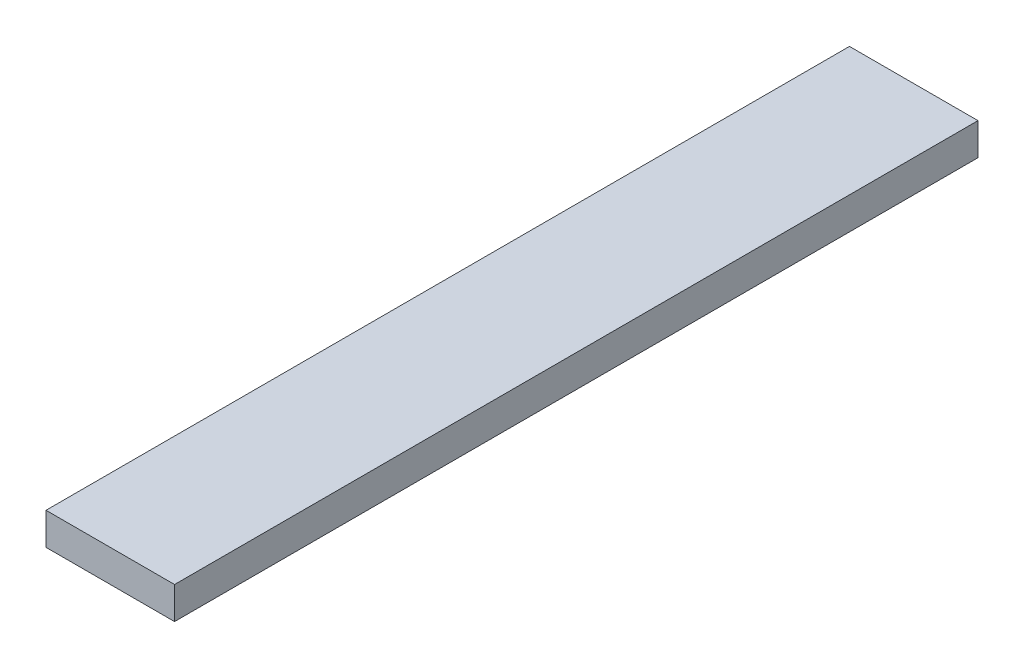
ISO-10303-21;
HEADER;
FILE_DESCRIPTION(('STEP AP214'),'2;1');
FILE_NAME('part.step','',(''),(''),'','','');
FILE_SCHEMA(('AUTOMOTIVE_DESIGN { 1 0 10303 214 1 1 1 1 }'));
ENDSEC;
DATA;
#1=APPLICATION_CONTEXT('core data for automotive mechanical design processes');
#2=APPLICATION_PROTOCOL_DEFINITION('international standard','automotive_design',2000,#1);
#3=PRODUCT_CONTEXT('',#1,'mechanical');
#4=PRODUCT('Part','Part','',(#3));
#5=PRODUCT_RELATED_PRODUCT_CATEGORY('part','',(#4));
#6=PRODUCT_DEFINITION_FORMATION('','',#4);
#7=PRODUCT_DEFINITION_CONTEXT('part definition',#1,'design');
#8=PRODUCT_DEFINITION('design','',#6,#7);
#9=PRODUCT_DEFINITION_SHAPE('','',#8);
#10=(LENGTH_UNIT() NAMED_UNIT(*) SI_UNIT(.MILLI.,.METRE.));
#11=(NAMED_UNIT(*) PLANE_ANGLE_UNIT() SI_UNIT($,.RADIAN.));
#12=(NAMED_UNIT(*) SI_UNIT($,.STERADIAN.) SOLID_ANGLE_UNIT());
#13=UNCERTAINTY_MEASURE_WITH_UNIT(LENGTH_MEASURE(1.E-05),#10,'distance_accuracy_value','');
#14=(GEOMETRIC_REPRESENTATION_CONTEXT(3) GLOBAL_UNCERTAINTY_ASSIGNED_CONTEXT((#13)) GLOBAL_UNIT_ASSIGNED_CONTEXT((#10,
#11,#12)) REPRESENTATION_CONTEXT('',''));
#15=CARTESIAN_POINT('',(0.,0.,0.));
#16=DIRECTION('',(0.,0.,1.));
#17=DIRECTION('',(1.,0.,0.));
#18=AXIS2_PLACEMENT_3D('',#15,#16,#17);
#19=CARTESIAN_POINT('',(0.,6.34999999999999,3.33066907387547E-13));
#20=DIRECTION('',(1.,0.,0.));
#21=DIRECTION('',(0.,0.,-1.));
#22=AXIS2_PLACEMENT_3D('',#19,#20,#21);
#23=PLANE('',#22);
#24=DIRECTION('',(0.,0.,1.));
#25=VECTOR('',#24,1.);
#26=CARTESIAN_POINT('',(0.,0.,0.));
#27=LINE('',#26,#25);
#28=CARTESIAN_POINT('',(1.38777878078145E-13,0.,-304.799999999999));
#29=VERTEX_POINT('',#28);
#30=CARTESIAN_POINT('',(1.38777878078145E-13,0.,-146.05));
#31=VERTEX_POINT('',#30);
#32=EDGE_CURVE('E99',#29,#31,#27,.T.);
#33=ORIENTED_EDGE('',*,*,#32,.T.);
#34=DIRECTION('',(0.,1.,0.));
#35=VECTOR('',#34,1.);
#36=CARTESIAN_POINT('',(1.38777878078145E-13,0.,-146.05));
#37=LINE('',#36,#35);
#38=CARTESIAN_POINT('',(0.,6.35000000000022,-146.05));
#39=VERTEX_POINT('',#38);
#40=EDGE_CURVE('E48',#31,#39,#37,.T.);
#41=ORIENTED_EDGE('',*,*,#40,.T.);
#42=DIRECTION('',(0.,0.,1.));
#43=VECTOR('',#42,1.);
#44=CARTESIAN_POINT('',(0.,6.34999999999999,3.33066907387547E-13));
#45=LINE('',#44,#43);
#46=CARTESIAN_POINT('',(0.,6.35000000000024,-304.799999999999));
#47=VERTEX_POINT('',#46);
#48=EDGE_CURVE('E101',#47,#39,#45,.T.);
#49=ORIENTED_EDGE('',*,*,#48,.F.);
#50=DIRECTION('',(0.,-1.,0.));
#51=VECTOR('',#50,1.);
#52=CARTESIAN_POINT('',(0.,6.35000000000024,-304.799999999999));
#53=LINE('',#52,#51);
#54=EDGE_CURVE('E11',#47,#29,#53,.T.);
#55=ORIENTED_EDGE('',*,*,#54,.T.);
#56=EDGE_LOOP('',(#33,#41,#49,#55));
#57=FACE_BOUND('',#56,.T.);
#58=ADVANCED_FACE('F34',(#57),#23,.F.);
#59=CARTESIAN_POINT('',(0.,6.35000000000024,-304.799999999999));
#60=DIRECTION('',(0.,0.,1.));
#61=DIRECTION('',(1.,0.,0.));
#62=AXIS2_PLACEMENT_3D('',#59,#60,#61);
#63=PLANE('',#62);
#64=DIRECTION('',(-1.,0.,0.));
#65=VECTOR('',#64,1.);
#66=CARTESIAN_POINT('',(0.,6.35000000000024,-304.799999999999));
#67=LINE('',#66,#65);
#68=CARTESIAN_POINT('',(25.4,6.35000000000002,-304.799999999999));
#69=VERTEX_POINT('',#68);
#70=EDGE_CURVE('E41',#69,#47,#67,.T.);
#71=ORIENTED_EDGE('',*,*,#70,.F.);
#72=DIRECTION('',(0.,1.,0.));
#73=VECTOR('',#72,1.);
#74=CARTESIAN_POINT('',(25.4000000000001,0.,-304.799999999999));
#75=LINE('',#74,#73);
#76=CARTESIAN_POINT('',(25.4000000000001,0.,-304.799999999999));
#77=VERTEX_POINT('',#76);
#78=EDGE_CURVE('E97',#77,#69,#75,.T.);
#79=ORIENTED_EDGE('',*,*,#78,.F.);
#80=DIRECTION('',(-1.,0.,0.));
#81=VECTOR('',#80,1.);
#82=CARTESIAN_POINT('',(1.38777878078145E-13,0.,-304.799999999999));
#83=LINE('',#82,#81);
#84=EDGE_CURVE('E91',#77,#29,#83,.T.);
#85=ORIENTED_EDGE('',*,*,#84,.T.);
#86=ORIENTED_EDGE('',*,*,#54,.F.);
#87=EDGE_LOOP('',(#71,#79,#85,#86));
#88=FACE_BOUND('',#87,.T.);
#89=ADVANCED_FACE('F105',(#88),#63,.F.);
#90=CARTESIAN_POINT('',(0.,6.34999999999999,3.33066907387547E-13));
#91=DIRECTION('',(0.,-1.,0.));
#92=DIRECTION('',(0.,0.,-1.));
#93=AXIS2_PLACEMENT_3D('',#90,#91,#92);
#94=PLANE('',#93);
#95=DIRECTION('',(-1.,0.,0.));
#96=VECTOR('',#95,1.);
#97=CARTESIAN_POINT('',(25.4,6.35000000000016,-146.05));
#98=LINE('',#97,#96);
#99=CARTESIAN_POINT('',(25.4,6.35000000000016,-146.05));
#100=VERTEX_POINT('',#99);
#101=EDGE_CURVE('E92',#100,#39,#98,.T.);
#102=ORIENTED_EDGE('',*,*,#101,.F.);
#103=DIRECTION('',(0.,0.,1.));
#104=VECTOR('',#103,1.);
#105=CARTESIAN_POINT('',(25.4,6.35000000000002,-304.799999999999));
#106=LINE('',#105,#104);
#107=EDGE_CURVE('E80',#69,#100,#106,.T.);
#108=ORIENTED_EDGE('',*,*,#107,.F.);
#109=ORIENTED_EDGE('',*,*,#70,.T.);
#110=ORIENTED_EDGE('',*,*,#48,.T.);
#111=EDGE_LOOP('',(#102,#108,#109,#110));
#112=FACE_BOUND('',#111,.T.);
#113=ADVANCED_FACE('F108',(#112),#94,.F.);
#114=CARTESIAN_POINT('',(0.,0.,0.));
#115=DIRECTION('',(0.,-1.,0.));
#116=DIRECTION('',(0.,0.,-1.));
#117=AXIS2_PLACEMENT_3D('',#114,#115,#116);
#118=PLANE('',#117);
#119=DIRECTION('',(0.,0.,1.));
#120=VECTOR('',#119,1.);
#121=CARTESIAN_POINT('',(25.4000000000001,0.,-304.799999999999));
#122=LINE('',#121,#120);
#123=CARTESIAN_POINT('',(25.4,2.22044604925031E-13,-146.05));
#124=VERTEX_POINT('',#123);
#125=EDGE_CURVE('E78',#77,#124,#122,.T.);
#126=ORIENTED_EDGE('',*,*,#125,.T.);
#127=DIRECTION('',(-1.,0.,0.));
#128=VECTOR('',#127,1.);
#129=CARTESIAN_POINT('',(25.4,2.22044604925031E-13,-146.05));
#130=LINE('',#129,#128);
#131=EDGE_CURVE('E82',#124,#31,#130,.T.);
#132=ORIENTED_EDGE('',*,*,#131,.T.);
#133=ORIENTED_EDGE('',*,*,#32,.F.);
#134=ORIENTED_EDGE('',*,*,#84,.F.);
#135=EDGE_LOOP('',(#126,#132,#133,#134));
#136=FACE_BOUND('',#135,.T.);
#137=ADVANCED_FACE('F90',(#136),#118,.T.);
#138=CARTESIAN_POINT('',(25.4000000000001,0.,-304.799999999999));
#139=DIRECTION('',(-1.,0.,0.));
#140=DIRECTION('',(0.,0.,1.));
#141=AXIS2_PLACEMENT_3D('',#138,#139,#140);
#142=PLANE('',#141);
#143=ORIENTED_EDGE('',*,*,#107,.T.);
#144=DIRECTION('',(0.,1.,0.));
#145=VECTOR('',#144,1.);
#146=CARTESIAN_POINT('',(25.4,2.22044604925031E-13,-146.05));
#147=LINE('',#146,#145);
#148=EDGE_CURVE('E75',#124,#100,#147,.T.);
#149=ORIENTED_EDGE('',*,*,#148,.F.);
#150=ORIENTED_EDGE('',*,*,#125,.F.);
#151=ORIENTED_EDGE('',*,*,#78,.T.);
#152=EDGE_LOOP('',(#143,#149,#150,#151));
#153=FACE_BOUND('',#152,.T.);
#154=ADVANCED_FACE('F76',(#153),#142,.F.);
#155=CARTESIAN_POINT('',(25.4,2.22044604925031E-13,-146.05));
#156=DIRECTION('',(0.,0.,-1.));
#157=DIRECTION('',(-1.,0.,0.));
#158=AXIS2_PLACEMENT_3D('',#155,#156,#157);
#159=PLANE('',#158);
#160=ORIENTED_EDGE('',*,*,#101,.T.);
#161=ORIENTED_EDGE('',*,*,#40,.F.);
#162=ORIENTED_EDGE('',*,*,#131,.F.);
#163=ORIENTED_EDGE('',*,*,#148,.T.);
#164=EDGE_LOOP('',(#160,#161,#162,#163));
#165=FACE_BOUND('',#164,.T.);
#166=ADVANCED_FACE('F84',(#165),#159,.F.);
#167=CLOSED_SHELL('',(#58,#89,#113,#137,#154,#166));
#168=MANIFOLD_SOLID_BREP('B2',#167);
#169=ADVANCED_BREP_SHAPE_REPRESENTATION('',(#18,#168),#14);
#170=SHAPE_DEFINITION_REPRESENTATION(#9,#169);
ENDSEC;
END-ISO-10303-21;
